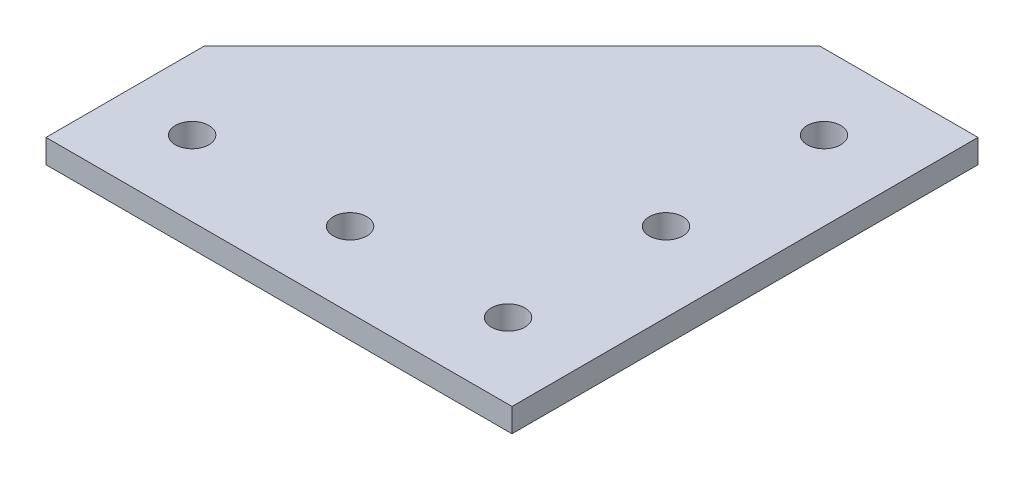
ISO-10303-21;
HEADER;
FILE_DESCRIPTION(('STEP AP214'),'2;1');
FILE_NAME('part.step','',(''),(''),'','','');
FILE_SCHEMA(('AUTOMOTIVE_DESIGN { 1 0 10303 214 1 1 1 1 }'));
ENDSEC;
DATA;
#1=APPLICATION_CONTEXT('core data for automotive mechanical design processes');
#2=APPLICATION_PROTOCOL_DEFINITION('international standard','automotive_design',2000,#1);
#3=PRODUCT_CONTEXT('',#1,'mechanical');
#4=PRODUCT('Part','Part','',(#3));
#5=PRODUCT_RELATED_PRODUCT_CATEGORY('part','',(#4));
#6=PRODUCT_DEFINITION_FORMATION('','',#4);
#7=PRODUCT_DEFINITION_CONTEXT('part definition',#1,'design');
#8=PRODUCT_DEFINITION('design','',#6,#7);
#9=PRODUCT_DEFINITION_SHAPE('','',#8);
#10=(LENGTH_UNIT() NAMED_UNIT(*) SI_UNIT(.MILLI.,.METRE.));
#11=(NAMED_UNIT(*) PLANE_ANGLE_UNIT() SI_UNIT($,.RADIAN.));
#12=(NAMED_UNIT(*) SI_UNIT($,.STERADIAN.) SOLID_ANGLE_UNIT());
#13=UNCERTAINTY_MEASURE_WITH_UNIT(LENGTH_MEASURE(1.E-05),#10,'distance_accuracy_value','');
#14=(GEOMETRIC_REPRESENTATION_CONTEXT(3) GLOBAL_UNCERTAINTY_ASSIGNED_CONTEXT((#13)) GLOBAL_UNIT_ASSIGNED_CONTEXT((#10,
#11,#12)) REPRESENTATION_CONTEXT('',''));
#15=CARTESIAN_POINT('',(0.,0.,0.));
#16=DIRECTION('',(0.,0.,1.));
#17=DIRECTION('',(1.,0.,0.));
#18=AXIS2_PLACEMENT_3D('',#15,#16,#17);
#19=CARTESIAN_POINT('',(0.,6.,0.));
#20=DIRECTION('',(0.,1.,0.));
#21=DIRECTION('',(0.,0.,1.));
#22=AXIS2_PLACEMENT_3D('',#19,#20,#21);
#23=PLANE('',#22);
#24=CARTESIAN_POINT('',(86.1882906342315,6.,-46.6427108155045));
#25=DIRECTION('',(0.,1.,0.));
#26=DIRECTION('',(0.,0.,1.));
#27=AXIS2_PLACEMENT_3D('',#24,#25,#26);
#28=CIRCLE('',#27,4.25);
#29=CARTESIAN_POINT('',(86.1882906342315,6.,-42.3927108155045));
#30=VERTEX_POINT('',#29);
#31=EDGE_CURVE('E203',#30,#30,#28,.T.);
#32=ORIENTED_EDGE('',*,*,#31,.F.);
#33=EDGE_LOOP('',(#32));
#34=FACE_BOUND('',#33,.T.);
#35=CARTESIAN_POINT('',(126.188290634232,6.,-86.6427108155045));
#36=DIRECTION('',(0.,1.,0.));
#37=DIRECTION('',(0.,0.,1.));
#38=AXIS2_PLACEMENT_3D('',#35,#36,#37);
#39=CIRCLE('',#38,4.25000000000001);
#40=CARTESIAN_POINT('',(126.188290634232,6.,-82.3927108155045));
#41=VERTEX_POINT('',#40);
#42=EDGE_CURVE('E219',#41,#41,#39,.T.);
#43=ORIENTED_EDGE('',*,*,#42,.F.);
#44=EDGE_LOOP('',(#43));
#45=FACE_BOUND('',#44,.T.);
#46=DIRECTION('',(0.,0.,1.));
#47=VECTOR('',#46,1.);
#48=CARTESIAN_POINT('',(28.1882906342316,6.,-27.6427108155045));
#49=LINE('',#48,#47);
#50=CARTESIAN_POINT('',(28.1882906342316,6.,-67.6427108155045));
#51=VERTEX_POINT('',#50);
#52=CARTESIAN_POINT('',(28.1882906342316,6.,-27.6427108155045));
#53=VERTEX_POINT('',#52);
#54=EDGE_CURVE('E139',#51,#53,#49,.T.);
#55=ORIENTED_EDGE('',*,*,#54,.T.);
#56=DIRECTION('',(1.,0.,0.));
#57=VECTOR('',#56,1.);
#58=CARTESIAN_POINT('',(28.1882906342316,6.,-27.6427108155045));
#59=LINE('',#58,#57);
#60=CARTESIAN_POINT('',(146.188290634232,6.,-27.6427108155045));
#61=VERTEX_POINT('',#60);
#62=EDGE_CURVE('E97',#53,#61,#59,.T.);
#63=ORIENTED_EDGE('',*,*,#62,.T.);
#64=DIRECTION('',(0.,0.,-1.));
#65=VECTOR('',#64,1.);
#66=CARTESIAN_POINT('',(146.188290634232,6.,-27.6427108155045));
#67=LINE('',#66,#65);
#68=CARTESIAN_POINT('',(146.188290634232,6.,-145.642710815504));
#69=VERTEX_POINT('',#68);
#70=EDGE_CURVE('E101',#61,#69,#67,.T.);
#71=ORIENTED_EDGE('',*,*,#70,.T.);
#72=DIRECTION('',(-1.,0.,0.));
#73=VECTOR('',#72,1.);
#74=CARTESIAN_POINT('',(146.188290634232,6.,-145.642710815504));
#75=LINE('',#74,#73);
#76=CARTESIAN_POINT('',(106.188290634232,6.,-145.642710815504));
#77=VERTEX_POINT('',#76);
#78=EDGE_CURVE('E105',#69,#77,#75,.T.);
#79=ORIENTED_EDGE('',*,*,#78,.T.);
#80=DIRECTION('',(-0.707106781186548,0.,0.707106781186548));
#81=VECTOR('',#80,1.);
#82=CARTESIAN_POINT('',(28.1882906342316,6.,-67.6427108155045));
#83=LINE('',#82,#81);
#84=EDGE_CURVE('E63',#77,#51,#83,.T.);
#85=ORIENTED_EDGE('',*,*,#84,.T.);
#86=EDGE_LOOP('',(#55,#63,#71,#79,#85));
#87=FACE_BOUND('',#86,.T.);
#88=CARTESIAN_POINT('',(126.188290634232,6.,-126.642710815504));
#89=DIRECTION('',(0.,1.,0.));
#90=DIRECTION('',(0.,0.,1.));
#91=AXIS2_PLACEMENT_3D('',#88,#89,#90);
#92=CIRCLE('',#91,4.25000000000001);
#93=CARTESIAN_POINT('',(126.188290634232,6.,-122.392710815504));
#94=VERTEX_POINT('',#93);
#95=EDGE_CURVE('E130',#94,#94,#92,.T.);
#96=ORIENTED_EDGE('',*,*,#95,.F.);
#97=EDGE_LOOP('',(#96));
#98=FACE_BOUND('',#97,.T.);
#99=CARTESIAN_POINT('',(126.188290634232,6.,-46.6427108155045));
#100=DIRECTION('',(0.,1.,0.));
#101=DIRECTION('',(0.,0.,1.));
#102=AXIS2_PLACEMENT_3D('',#99,#100,#101);
#103=CIRCLE('',#102,4.25000000000001);
#104=CARTESIAN_POINT('',(126.188290634232,6.,-42.3927108155045));
#105=VERTEX_POINT('',#104);
#106=EDGE_CURVE('E211',#105,#105,#103,.T.);
#107=ORIENTED_EDGE('',*,*,#106,.F.);
#108=EDGE_LOOP('',(#107));
#109=FACE_BOUND('',#108,.T.);
#110=CARTESIAN_POINT('',(46.1882906342315,6.,-46.6427108155045));
#111=DIRECTION('',(0.,1.,0.));
#112=DIRECTION('',(0.,0.,1.));
#113=AXIS2_PLACEMENT_3D('',#110,#111,#112);
#114=CIRCLE('',#113,4.25);
#115=CARTESIAN_POINT('',(46.1882906342315,6.,-42.3927108155045));
#116=VERTEX_POINT('',#115);
#117=EDGE_CURVE('E192',#116,#116,#114,.T.);
#118=ORIENTED_EDGE('',*,*,#117,.F.);
#119=EDGE_LOOP('',(#118));
#120=FACE_BOUND('',#119,.T.);
#121=ADVANCED_FACE('F45',(#34,#45,#87,#98,#109,#120),#23,.T.);
#122=CARTESIAN_POINT('',(0.,0.,0.));
#123=DIRECTION('',(0.,1.,0.));
#124=DIRECTION('',(0.,0.,1.));
#125=AXIS2_PLACEMENT_3D('',#122,#123,#124);
#126=PLANE('',#125);
#127=DIRECTION('',(0.,0.,1.));
#128=VECTOR('',#127,1.);
#129=CARTESIAN_POINT('',(28.1882906342316,0.,-27.6427108155045));
#130=LINE('',#129,#128);
#131=CARTESIAN_POINT('',(28.1882906342316,0.,-67.6427108155045));
#132=VERTEX_POINT('',#131);
#133=CARTESIAN_POINT('',(28.1882906342316,0.,-27.6427108155045));
#134=VERTEX_POINT('',#133);
#135=EDGE_CURVE('E125',#132,#134,#130,.T.);
#136=ORIENTED_EDGE('',*,*,#135,.F.);
#137=DIRECTION('',(-0.707106781186548,0.,0.707106781186548));
#138=VECTOR('',#137,1.);
#139=CARTESIAN_POINT('',(28.1882906342316,0.,-67.6427108155045));
#140=LINE('',#139,#138);
#141=CARTESIAN_POINT('',(106.188290634232,0.,-145.642710815504));
#142=VERTEX_POINT('',#141);
#143=EDGE_CURVE('E89',#142,#132,#140,.T.);
#144=ORIENTED_EDGE('',*,*,#143,.F.);
#145=DIRECTION('',(-1.,0.,0.));
#146=VECTOR('',#145,1.);
#147=CARTESIAN_POINT('',(146.188290634232,0.,-145.642710815504));
#148=LINE('',#147,#146);
#149=CARTESIAN_POINT('',(146.188290634232,0.,-145.642710815504));
#150=VERTEX_POINT('',#149);
#151=EDGE_CURVE('E83',#150,#142,#148,.T.);
#152=ORIENTED_EDGE('',*,*,#151,.F.);
#153=DIRECTION('',(0.,0.,-1.));
#154=VECTOR('',#153,1.);
#155=CARTESIAN_POINT('',(146.188290634232,0.,-27.6427108155045));
#156=LINE('',#155,#154);
#157=CARTESIAN_POINT('',(146.188290634232,0.,-27.6427108155045));
#158=VERTEX_POINT('',#157);
#159=EDGE_CURVE('E113',#158,#150,#156,.T.);
#160=ORIENTED_EDGE('',*,*,#159,.F.);
#161=DIRECTION('',(1.,0.,0.));
#162=VECTOR('',#161,1.);
#163=CARTESIAN_POINT('',(28.1882906342316,0.,-27.6427108155045));
#164=LINE('',#163,#162);
#165=EDGE_CURVE('E129',#134,#158,#164,.T.);
#166=ORIENTED_EDGE('',*,*,#165,.F.);
#167=EDGE_LOOP('',(#136,#144,#152,#160,#166));
#168=FACE_BOUND('',#167,.T.);
#169=CARTESIAN_POINT('',(126.188290634232,0.,-126.642710815504));
#170=DIRECTION('',(0.,1.,0.));
#171=DIRECTION('',(0.,0.,1.));
#172=AXIS2_PLACEMENT_3D('',#169,#170,#171);
#173=CIRCLE('',#172,4.25000000000001);
#174=CARTESIAN_POINT('',(126.188290634232,0.,-122.392710815504));
#175=VERTEX_POINT('',#174);
#176=EDGE_CURVE('E223',#175,#175,#173,.T.);
#177=ORIENTED_EDGE('',*,*,#176,.T.);
#178=EDGE_LOOP('',(#177));
#179=FACE_BOUND('',#178,.T.);
#180=CARTESIAN_POINT('',(126.188290634232,0.,-86.6427108155045));
#181=DIRECTION('',(0.,1.,0.));
#182=DIRECTION('',(0.,0.,1.));
#183=AXIS2_PLACEMENT_3D('',#180,#181,#182);
#184=CIRCLE('',#183,4.25000000000001);
#185=CARTESIAN_POINT('',(126.188290634232,0.,-82.3927108155045));
#186=VERTEX_POINT('',#185);
#187=EDGE_CURVE('E215',#186,#186,#184,.T.);
#188=ORIENTED_EDGE('',*,*,#187,.T.);
#189=EDGE_LOOP('',(#188));
#190=FACE_BOUND('',#189,.T.);
#191=CARTESIAN_POINT('',(126.188290634232,0.,-46.6427108155045));
#192=DIRECTION('',(0.,1.,0.));
#193=DIRECTION('',(0.,0.,1.));
#194=AXIS2_PLACEMENT_3D('',#191,#192,#193);
#195=CIRCLE('',#194,4.25000000000001);
#196=CARTESIAN_POINT('',(126.188290634232,0.,-42.3927108155045));
#197=VERTEX_POINT('',#196);
#198=EDGE_CURVE('E207',#197,#197,#195,.T.);
#199=ORIENTED_EDGE('',*,*,#198,.T.);
#200=EDGE_LOOP('',(#199));
#201=FACE_BOUND('',#200,.T.);
#202=CARTESIAN_POINT('',(86.1882906342315,0.,-46.6427108155045));
#203=DIRECTION('',(0.,1.,0.));
#204=DIRECTION('',(0.,0.,1.));
#205=AXIS2_PLACEMENT_3D('',#202,#203,#204);
#206=CIRCLE('',#205,4.25);
#207=CARTESIAN_POINT('',(86.1882906342315,0.,-42.3927108155045));
#208=VERTEX_POINT('',#207);
#209=EDGE_CURVE('E200',#208,#208,#206,.T.);
#210=ORIENTED_EDGE('',*,*,#209,.T.);
#211=EDGE_LOOP('',(#210));
#212=FACE_BOUND('',#211,.T.);
#213=CARTESIAN_POINT('',(46.1882906342315,0.,-46.6427108155045));
#214=DIRECTION('',(0.,1.,0.));
#215=DIRECTION('',(0.,0.,1.));
#216=AXIS2_PLACEMENT_3D('',#213,#214,#215);
#217=CIRCLE('',#216,4.25);
#218=CARTESIAN_POINT('',(46.1882906342315,0.,-42.3927108155045));
#219=VERTEX_POINT('',#218);
#220=EDGE_CURVE('E195',#219,#219,#217,.T.);
#221=ORIENTED_EDGE('',*,*,#220,.T.);
#222=EDGE_LOOP('',(#221));
#223=FACE_BOUND('',#222,.T.);
#224=ADVANCED_FACE('F146',(#168,#179,#190,#201,#212,#223),#126,.F.);
#225=CARTESIAN_POINT('',(28.1882906342316,6.,-27.6427108155045));
#226=DIRECTION('',(1.,0.,0.));
#227=DIRECTION('',(0.,0.,-1.));
#228=AXIS2_PLACEMENT_3D('',#225,#226,#227);
#229=PLANE('',#228);
#230=ORIENTED_EDGE('',*,*,#135,.T.);
#231=DIRECTION('',(0.,-1.,0.));
#232=VECTOR('',#231,1.);
#233=CARTESIAN_POINT('',(28.1882906342316,6.,-27.6427108155045));
#234=LINE('',#233,#232);
#235=EDGE_CURVE('E11',#53,#134,#234,.T.);
#236=ORIENTED_EDGE('',*,*,#235,.F.);
#237=ORIENTED_EDGE('',*,*,#54,.F.);
#238=DIRECTION('',(0.,-1.,0.));
#239=VECTOR('',#238,1.);
#240=CARTESIAN_POINT('',(28.1882906342316,6.,-67.6427108155045));
#241=LINE('',#240,#239);
#242=EDGE_CURVE('E121',#51,#132,#241,.T.);
#243=ORIENTED_EDGE('',*,*,#242,.T.);
#244=EDGE_LOOP('',(#230,#236,#237,#243));
#245=FACE_BOUND('',#244,.T.);
#246=ADVANCED_FACE('F47',(#245),#229,.F.);
#247=CARTESIAN_POINT('',(28.1882906342316,6.,-27.6427108155045));
#248=DIRECTION('',(0.,0.,-1.));
#249=DIRECTION('',(-1.,0.,0.));
#250=AXIS2_PLACEMENT_3D('',#247,#248,#249);
#251=PLANE('',#250);
#252=ORIENTED_EDGE('',*,*,#165,.T.);
#253=DIRECTION('',(0.,-1.,0.));
#254=VECTOR('',#253,1.);
#255=CARTESIAN_POINT('',(146.188290634232,6.,-27.6427108155045));
#256=LINE('',#255,#254);
#257=EDGE_CURVE('E55',#61,#158,#256,.T.);
#258=ORIENTED_EDGE('',*,*,#257,.F.);
#259=ORIENTED_EDGE('',*,*,#62,.F.);
#260=ORIENTED_EDGE('',*,*,#235,.T.);
#261=EDGE_LOOP('',(#252,#258,#259,#260));
#262=FACE_BOUND('',#261,.T.);
#263=ADVANCED_FACE('F291',(#262),#251,.F.);
#264=CARTESIAN_POINT('',(146.188290634232,6.,-27.6427108155045));
#265=DIRECTION('',(-1.,0.,0.));
#266=DIRECTION('',(0.,0.,1.));
#267=AXIS2_PLACEMENT_3D('',#264,#265,#266);
#268=PLANE('',#267);
#269=ORIENTED_EDGE('',*,*,#159,.T.);
#270=DIRECTION('',(0.,-1.,0.));
#271=VECTOR('',#270,1.);
#272=CARTESIAN_POINT('',(146.188290634232,6.,-145.642710815504));
#273=LINE('',#272,#271);
#274=EDGE_CURVE('E110',#69,#150,#273,.T.);
#275=ORIENTED_EDGE('',*,*,#274,.F.);
#276=ORIENTED_EDGE('',*,*,#70,.F.);
#277=ORIENTED_EDGE('',*,*,#257,.T.);
#278=EDGE_LOOP('',(#269,#275,#276,#277));
#279=FACE_BOUND('',#278,.T.);
#280=ADVANCED_FACE('F111',(#279),#268,.F.);
#281=CARTESIAN_POINT('',(146.188290634232,6.,-145.642710815504));
#282=DIRECTION('',(0.,0.,1.));
#283=DIRECTION('',(1.,0.,0.));
#284=AXIS2_PLACEMENT_3D('',#281,#282,#283);
#285=PLANE('',#284);
#286=ORIENTED_EDGE('',*,*,#151,.T.);
#287=DIRECTION('',(0.,-1.,0.));
#288=VECTOR('',#287,1.);
#289=CARTESIAN_POINT('',(106.188290634232,6.,-145.642710815504));
#290=LINE('',#289,#288);
#291=EDGE_CURVE('E115',#77,#142,#290,.T.);
#292=ORIENTED_EDGE('',*,*,#291,.F.);
#293=ORIENTED_EDGE('',*,*,#78,.F.);
#294=ORIENTED_EDGE('',*,*,#274,.T.);
#295=EDGE_LOOP('',(#286,#292,#293,#294));
#296=FACE_BOUND('',#295,.T.);
#297=ADVANCED_FACE('F117',(#296),#285,.F.);
#298=CARTESIAN_POINT('',(28.1882906342316,6.,-67.6427108155045));
#299=DIRECTION('',(0.707106781186547,0.,0.707106781186547));
#300=DIRECTION('',(0.707106781186548,0.,-0.707106781186548));
#301=AXIS2_PLACEMENT_3D('',#298,#299,#300);
#302=PLANE('',#301);
#303=ORIENTED_EDGE('',*,*,#143,.T.);
#304=ORIENTED_EDGE('',*,*,#242,.F.);
#305=ORIENTED_EDGE('',*,*,#84,.F.);
#306=ORIENTED_EDGE('',*,*,#291,.T.);
#307=EDGE_LOOP('',(#303,#304,#305,#306));
#308=FACE_BOUND('',#307,.T.);
#309=ADVANCED_FACE('F151',(#308),#302,.F.);
#310=CARTESIAN_POINT('',(126.188290634232,6.,-126.642710815504));
#311=DIRECTION('',(0.,-1.,0.));
#312=DIRECTION('',(0.,0.,-1.));
#313=AXIS2_PLACEMENT_3D('',#310,#311,#312);
#314=CYLINDRICAL_SURFACE('',#313,4.25000000000001);
#315=ORIENTED_EDGE('',*,*,#95,.T.);
#316=EDGE_LOOP('',(#315));
#317=FACE_BOUND('',#316,.T.);
#318=ORIENTED_EDGE('',*,*,#176,.F.);
#319=EDGE_LOOP('',(#318));
#320=FACE_BOUND('',#319,.T.);
#321=ADVANCED_FACE('F153',(#317,#320),#314,.F.);
#322=CARTESIAN_POINT('',(126.188290634232,6.,-86.6427108155045));
#323=DIRECTION('',(0.,-1.,0.));
#324=DIRECTION('',(0.,0.,-1.));
#325=AXIS2_PLACEMENT_3D('',#322,#323,#324);
#326=CYLINDRICAL_SURFACE('',#325,4.25000000000001);
#327=ORIENTED_EDGE('',*,*,#42,.T.);
#328=EDGE_LOOP('',(#327));
#329=FACE_BOUND('',#328,.T.);
#330=ORIENTED_EDGE('',*,*,#187,.F.);
#331=EDGE_LOOP('',(#330));
#332=FACE_BOUND('',#331,.T.);
#333=ADVANCED_FACE('F159',(#329,#332),#326,.F.);
#334=CARTESIAN_POINT('',(126.188290634232,6.,-46.6427108155045));
#335=DIRECTION('',(0.,-1.,0.));
#336=DIRECTION('',(0.,0.,-1.));
#337=AXIS2_PLACEMENT_3D('',#334,#335,#336);
#338=CYLINDRICAL_SURFACE('',#337,4.25000000000001);
#339=ORIENTED_EDGE('',*,*,#106,.T.);
#340=EDGE_LOOP('',(#339));
#341=FACE_BOUND('',#340,.T.);
#342=ORIENTED_EDGE('',*,*,#198,.F.);
#343=EDGE_LOOP('',(#342));
#344=FACE_BOUND('',#343,.T.);
#345=ADVANCED_FACE('F175',(#341,#344),#338,.F.);
#346=CARTESIAN_POINT('',(86.1882906342315,6.,-46.6427108155045));
#347=DIRECTION('',(0.,-1.,0.));
#348=DIRECTION('',(0.,0.,-1.));
#349=AXIS2_PLACEMENT_3D('',#346,#347,#348);
#350=CYLINDRICAL_SURFACE('',#349,4.25);
#351=ORIENTED_EDGE('',*,*,#31,.T.);
#352=EDGE_LOOP('',(#351));
#353=FACE_BOUND('',#352,.T.);
#354=ORIENTED_EDGE('',*,*,#209,.F.);
#355=EDGE_LOOP('',(#354));
#356=FACE_BOUND('',#355,.T.);
#357=ADVANCED_FACE('F179',(#353,#356),#350,.F.);
#358=CARTESIAN_POINT('',(46.1882906342315,6.,-46.6427108155045));
#359=DIRECTION('',(0.,-1.,0.));
#360=DIRECTION('',(0.,0.,-1.));
#361=AXIS2_PLACEMENT_3D('',#358,#359,#360);
#362=CYLINDRICAL_SURFACE('',#361,4.25);
#363=ORIENTED_EDGE('',*,*,#117,.T.);
#364=EDGE_LOOP('',(#363));
#365=FACE_BOUND('',#364,.T.);
#366=ORIENTED_EDGE('',*,*,#220,.F.);
#367=EDGE_LOOP('',(#366));
#368=FACE_BOUND('',#367,.T.);
#369=ADVANCED_FACE('F183',(#365,#368),#362,.F.);
#370=CLOSED_SHELL('',(#121,#224,#246,#263,#280,#297,#309,#321,#333,#345,#357,#369));
#371=MANIFOLD_SOLID_BREP('B2',#370);
#372=ADVANCED_BREP_SHAPE_REPRESENTATION('',(#18,#371),#14);
#373=SHAPE_DEFINITION_REPRESENTATION(#9,#372);
ENDSEC;
END-ISO-10303-21;
